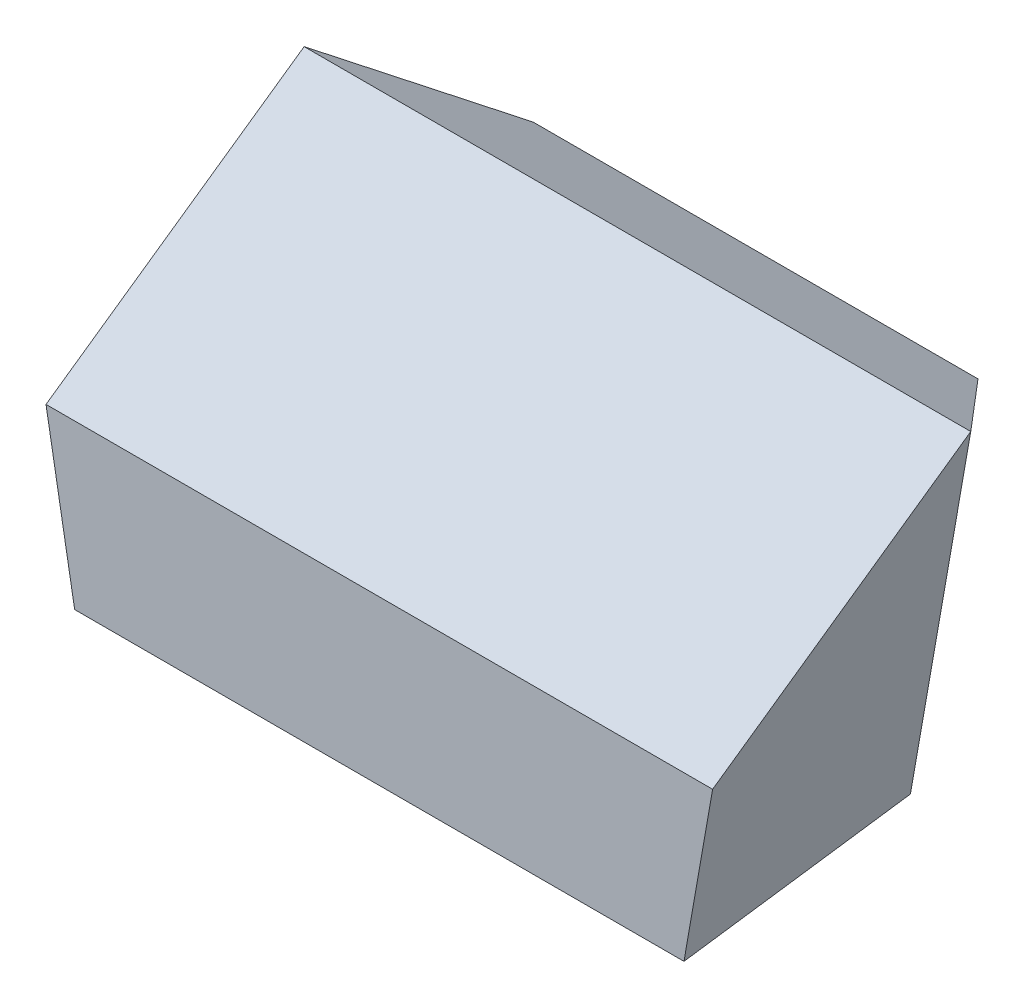
ISO-10303-21;
HEADER;
FILE_DESCRIPTION(('STEP AP214'),'2;1');
FILE_NAME('part.step','',(''),(''),'','','');
FILE_SCHEMA(('AUTOMOTIVE_DESIGN { 1 0 10303 214 1 1 1 1 }'));
ENDSEC;
DATA;
#1=APPLICATION_CONTEXT('core data for automotive mechanical design processes');
#2=APPLICATION_PROTOCOL_DEFINITION('international standard','automotive_design',2000,#1);
#3=PRODUCT_CONTEXT('',#1,'mechanical');
#4=PRODUCT('Part','Part','',(#3));
#5=PRODUCT_RELATED_PRODUCT_CATEGORY('part','',(#4));
#6=PRODUCT_DEFINITION_FORMATION('','',#4);
#7=PRODUCT_DEFINITION_CONTEXT('part definition',#1,'design');
#8=PRODUCT_DEFINITION('design','',#6,#7);
#9=PRODUCT_DEFINITION_SHAPE('','',#8);
#10=(LENGTH_UNIT() NAMED_UNIT(*) SI_UNIT(.MILLI.,.METRE.));
#11=(NAMED_UNIT(*) PLANE_ANGLE_UNIT() SI_UNIT($,.RADIAN.));
#12=(NAMED_UNIT(*) SI_UNIT($,.STERADIAN.) SOLID_ANGLE_UNIT());
#13=UNCERTAINTY_MEASURE_WITH_UNIT(LENGTH_MEASURE(1.E-05),#10,'distance_accuracy_value','');
#14=(GEOMETRIC_REPRESENTATION_CONTEXT(3) GLOBAL_UNCERTAINTY_ASSIGNED_CONTEXT((#13)) GLOBAL_UNIT_ASSIGNED_CONTEXT((#10,
#11,#12)) REPRESENTATION_CONTEXT('',''));
#15=CARTESIAN_POINT('',(0.,0.,0.));
#16=DIRECTION('',(0.,0.,1.));
#17=DIRECTION('',(1.,0.,0.));
#18=AXIS2_PLACEMENT_3D('',#15,#16,#17);
#19=CARTESIAN_POINT('',(0.,0.,0.));
#20=DIRECTION('',(0.,1.,0.));
#21=DIRECTION('',(0.,0.,1.));
#22=AXIS2_PLACEMENT_3D('',#19,#20,#21);
#23=PLANE('',#22);
#24=DIRECTION('',(-0.121869343405144,0.,0.992546151641322));
#25=VECTOR('',#24,1.);
#26=CARTESIAN_POINT('',(-75.4430878194198,0.,200.));
#27=LINE('',#26,#25);
#28=CARTESIAN_POINT('',(-66.3909576530534,0.,126.276316013991));
#29=VERTEX_POINT('',#28);
#30=CARTESIAN_POINT('',(-71.1456281878182,0.,165.));
#31=VERTEX_POINT('',#30);
#32=EDGE_CURVE('E89',#29,#31,#27,.T.);
#33=ORIENTED_EDGE('',*,*,#32,.F.);
#34=DIRECTION('',(-0.71225948077796,0.,0.701916257143194));
#35=VECTOR('',#34,1.);
#36=CARTESIAN_POINT('',(-49.874798816262,0.,110.));
#37=LINE('',#36,#35);
#38=CARTESIAN_POINT('',(-49.874798816262,0.,110.));
#39=VERTEX_POINT('',#38);
#40=EDGE_CURVE('E155',#39,#29,#37,.T.);
#41=ORIENTED_EDGE('',*,*,#40,.F.);
#42=DIRECTION('',(1.,0.,0.));
#43=VECTOR('',#42,1.);
#44=CARTESIAN_POINT('',(-49.874798816262,0.,110.));
#45=LINE('',#44,#43);
#46=CARTESIAN_POINT('',(1.87277538680775,0.,110.));
#47=VERTEX_POINT('',#46);
#48=EDGE_CURVE('E136',#39,#47,#45,.T.);
#49=ORIENTED_EDGE('',*,*,#48,.T.);
#50=DIRECTION('',(0.642084059629472,0.,0.766634241584431));
#51=VECTOR('',#50,1.);
#52=CARTESIAN_POINT('',(1.87277538680775,0.,110.));
#53=LINE('',#52,#51);
#54=CARTESIAN_POINT('',(15.5047820142139,0.,126.276316013991));
#55=VERTEX_POINT('',#54);
#56=EDGE_CURVE('E153',#47,#55,#53,.T.);
#57=ORIENTED_EDGE('',*,*,#56,.T.);
#58=DIRECTION('',(-0.121869343405144,0.,-0.992546151641322));
#59=VECTOR('',#58,1.);
#60=CARTESIAN_POINT('',(3.68353682708704,0.,30.));
#61=LINE('',#60,#59);
#62=CARTESIAN_POINT('',(20.2594525489787,0.,165.));
#63=VERTEX_POINT('',#62);
#64=EDGE_CURVE('E83',#63,#55,#61,.T.);
#65=ORIENTED_EDGE('',*,*,#64,.F.);
#66=DIRECTION('',(1.,0.,0.));
#67=VECTOR('',#66,1.);
#68=CARTESIAN_POINT('',(-75.4430878194198,0.,165.));
#69=LINE('',#68,#67);
#70=EDGE_CURVE('E96',#31,#63,#69,.T.);
#71=ORIENTED_EDGE('',*,*,#70,.F.);
#72=EDGE_LOOP('',(#33,#41,#49,#57,#65,#71));
#73=FACE_BOUND('',#72,.T.);
#74=ADVANCED_FACE('F78',(#73),#23,.F.);
#75=CARTESIAN_POINT('',(0.,93.969262078591,65.7979856674334));
#76=DIRECTION('',(0.,-0.819152044288991,-0.573576436351047));
#77=DIRECTION('',(0.,0.573576436351047,-0.819152044288991));
#78=AXIS2_PLACEMENT_3D('',#75,#76,#77);
#79=PLANE('',#78);
#80=DIRECTION('',(0.,-0.573576436351047,0.819152044288991));
#81=VECTOR('',#80,1.);
#82=CARTESIAN_POINT('',(-75.4430878194198,0.,200.));
#83=LINE('',#82,#81);
#84=CARTESIAN_POINT('',(-75.4430878194198,51.6218792715943,126.276316013991));
#85=VERTEX_POINT('',#84);
#86=CARTESIAN_POINT('',(-75.4430878194198,24.5072638373395,165.));
#87=VERTEX_POINT('',#86);
#88=EDGE_CURVE('E271',#85,#87,#83,.T.);
#89=ORIENTED_EDGE('',*,*,#88,.T.);
#90=DIRECTION('',(1.,0.,0.));
#91=VECTOR('',#90,1.);
#92=CARTESIAN_POINT('',(0.,24.50726383734,165.));
#93=LINE('',#92,#91);
#94=CARTESIAN_POINT('',(24.5569121805802,24.5072638373399,165.));
#95=VERTEX_POINT('',#94);
#96=EDGE_CURVE('E265',#87,#95,#93,.T.);
#97=ORIENTED_EDGE('',*,*,#96,.T.);
#98=DIRECTION('',(0.,0.573576436351047,-0.819152044288991));
#99=VECTOR('',#98,1.);
#100=CARTESIAN_POINT('',(24.5569121805802,0.,200.));
#101=LINE('',#100,#99);
#102=CARTESIAN_POINT('',(24.5569121805802,51.6218792715943,126.276316013991));
#103=VERTEX_POINT('',#102);
#104=EDGE_CURVE('E341',#95,#103,#101,.T.);
#105=ORIENTED_EDGE('',*,*,#104,.T.);
#106=DIRECTION('',(-1.,0.,0.));
#107=VECTOR('',#106,1.);
#108=CARTESIAN_POINT('',(-75.4430878194198,51.6218792715943,126.276316013991));
#109=LINE('',#108,#107);
#110=EDGE_CURVE('E344',#103,#85,#109,.T.);
#111=ORIENTED_EDGE('',*,*,#110,.T.);
#112=EDGE_LOOP('',(#89,#97,#105,#111));
#113=FACE_BOUND('',#112,.T.);
#114=ADVANCED_FACE('F308',(#113),#79,.F.);
#115=CARTESIAN_POINT('',(-75.4430878194198,0.,200.));
#116=DIRECTION('',(-0.977845939688711,-0.171469711169267,-0.120064384335363));
#117=DIRECTION('',(0.,0.573576436351047,-0.819152044288991));
#118=AXIS2_PLACEMENT_3D('',#115,#116,#117);
#119=PLANE('',#118);
#120=DIRECTION('',(-0.172719142932958,0.984971115142218,0.));
#121=VECTOR('',#120,1.);
#122=CARTESIAN_POINT('',(-66.6609999161046,1.53997886080496,126.276316013991));
#123=LINE('',#122,#121);
#124=EDGE_CURVE('E165',#29,#85,#123,.T.);
#125=ORIENTED_EDGE('',*,*,#124,.F.);
#126=ORIENTED_EDGE('',*,*,#32,.T.);
#127=DIRECTION('',(0.172719142932958,-0.984971115142218,0.));
#128=VECTOR('',#127,1.);
#129=CARTESIAN_POINT('',(-71.2738295838389,0.731098301305763,165.));
#130=LINE('',#129,#128);
#131=EDGE_CURVE('E267',#87,#31,#130,.T.);
#132=ORIENTED_EDGE('',*,*,#131,.F.);
#133=ORIENTED_EDGE('',*,*,#88,.F.);
#134=EDGE_LOOP('',(#125,#126,#132,#133));
#135=FACE_BOUND('',#134,.T.);
#136=ADVANCED_FACE('F80',(#135),#119,.T.);
#137=CARTESIAN_POINT('',(24.5569121805802,51.6218792715943,126.276316013991));
#138=DIRECTION('',(0.977845939688711,-0.171469711169267,-0.120064384335363));
#139=DIRECTION('',(0.,-0.573576436351047,0.819152044288991));
#140=AXIS2_PLACEMENT_3D('',#137,#138,#139);
#141=PLANE('',#140);
#142=DIRECTION('',(-0.172719142932958,-0.984971115142218,0.));
#143=VECTOR('',#142,1.);
#144=CARTESIAN_POINT('',(24.5569121805802,51.6218792715943,126.276316013991));
#145=LINE('',#144,#143);
#146=EDGE_CURVE('E162',#103,#55,#145,.T.);
#147=ORIENTED_EDGE('',*,*,#146,.F.);
#148=ORIENTED_EDGE('',*,*,#104,.F.);
#149=DIRECTION('',(0.172719142932958,0.984971115142218,0.));
#150=VECTOR('',#149,1.);
#151=CARTESIAN_POINT('',(29.1697418483145,50.8129987120951,165.));
#152=LINE('',#151,#150);
#153=EDGE_CURVE('E12',#63,#95,#152,.T.);
#154=ORIENTED_EDGE('',*,*,#153,.F.);
#155=ORIENTED_EDGE('',*,*,#64,.T.);
#156=EDGE_LOOP('',(#147,#148,#154,#155));
#157=FACE_BOUND('',#156,.T.);
#158=ADVANCED_FACE('F295',(#157),#141,.T.);
#159=CARTESIAN_POINT('',(-75.4430878194198,51.6268892715943,165.));
#160=DIRECTION('',(0.,0.,-1.));
#161=DIRECTION('',(-1.,0.,0.));
#162=AXIS2_PLACEMENT_3D('',#159,#160,#161);
#163=PLANE('',#162);
#164=ORIENTED_EDGE('',*,*,#131,.T.);
#165=ORIENTED_EDGE('',*,*,#70,.T.);
#166=ORIENTED_EDGE('',*,*,#153,.T.);
#167=ORIENTED_EDGE('',*,*,#96,.F.);
#168=EDGE_LOOP('',(#164,#165,#166,#167));
#169=FACE_BOUND('',#168,.T.);
#170=ADVANCED_FACE('F196',(#169),#163,.F.);
#171=CARTESIAN_POINT('',(0.,0.,110.));
#172=DIRECTION('',(0.,0.,1.));
#173=DIRECTION('',(1.,0.,0.));
#174=AXIS2_PLACEMENT_3D('',#171,#172,#173);
#175=PLANE('',#174);
#176=ORIENTED_EDGE('',*,*,#48,.F.);
#177=DIRECTION('',(0.172719142932958,-0.984971115142218,0.));
#178=VECTOR('',#177,1.);
#179=CARTESIAN_POINT('',(-57.3666434640963,42.7239879259585,110.));
#180=LINE('',#179,#178);
#181=CARTESIAN_POINT('',(-57.3666434640963,42.7239879259585,110.));
#182=VERTEX_POINT('',#181);
#183=EDGE_CURVE('E211',#182,#39,#180,.T.);
#184=ORIENTED_EDGE('',*,*,#183,.F.);
#185=DIRECTION('',(-1.,0.,0.));
#186=VECTOR('',#185,1.);
#187=CARTESIAN_POINT('',(9.36462003464204,42.7239879259585,110.));
#188=LINE('',#187,#186);
#189=CARTESIAN_POINT('',(9.36462003464204,42.7239879259585,110.));
#190=VERTEX_POINT('',#189);
#191=EDGE_CURVE('E139',#190,#182,#188,.T.);
#192=ORIENTED_EDGE('',*,*,#191,.F.);
#193=DIRECTION('',(0.172719142932958,0.984971115142218,0.));
#194=VECTOR('',#193,1.);
#195=CARTESIAN_POINT('',(1.87277538680775,0.,110.));
#196=LINE('',#195,#194);
#197=EDGE_CURVE('E132',#47,#190,#196,.T.);
#198=ORIENTED_EDGE('',*,*,#197,.F.);
#199=EDGE_LOOP('',(#176,#184,#192,#198));
#200=FACE_BOUND('',#199,.T.);
#201=ADVANCED_FACE('F135',(#200),#175,.F.);
#202=CARTESIAN_POINT('',(0.,-13.4044939648616,7.32793162408773));
#203=DIRECTION('',(0.,0.877444181984261,-0.479678754482592));
#204=DIRECTION('',(0.,0.479678754482592,0.877444181984261));
#205=AXIS2_PLACEMENT_3D('',#202,#203,#204);
#206=PLANE('',#205);
#207=DIRECTION('',(-0.697912044552852,0.343538000016743,0.628411028398256));
#208=VECTOR('',#207,1.);
#209=CARTESIAN_POINT('',(-57.3666434640963,42.7239879259585,110.));
#210=LINE('',#209,#208);
#211=EDGE_CURVE('E203',#182,#85,#210,.T.);
#212=ORIENTED_EDGE('',*,*,#211,.T.);
#213=ORIENTED_EDGE('',*,*,#110,.F.);
#214=DIRECTION('',(0.63361931140678,0.371101064489561,0.678830294069963));
#215=VECTOR('',#214,1.);
#216=CARTESIAN_POINT('',(9.36462003464204,42.7239879259585,110.));
#217=LINE('',#216,#215);
#218=EDGE_CURVE('E167',#190,#103,#217,.T.);
#219=ORIENTED_EDGE('',*,*,#218,.F.);
#220=ORIENTED_EDGE('',*,*,#191,.T.);
#221=EDGE_LOOP('',(#212,#213,#219,#220));
#222=FACE_BOUND('',#221,.T.);
#223=ADVANCED_FACE('F189',(#222),#206,.T.);
#224=CARTESIAN_POINT('',(-52.1044751143805,9.13675553158536,43.63939293549));
#225=DIRECTION('',(0.759799370565935,-0.133234258413965,-0.636359606568872));
#226=DIRECTION('',(-0.642084059629473,0.,-0.766634241584431));
#227=AXIS2_PLACEMENT_3D('',#224,#225,#226);
#228=PLANE('',#227);
#229=ORIENTED_EDGE('',*,*,#218,.T.);
#230=ORIENTED_EDGE('',*,*,#146,.T.);
#231=ORIENTED_EDGE('',*,*,#56,.F.);
#232=ORIENTED_EDGE('',*,*,#197,.T.);
#233=EDGE_LOOP('',(#229,#230,#231,#232));
#234=FACE_BOUND('',#233,.T.);
#235=ADVANCED_FACE('F160',(#234),#228,.T.);
#236=CARTESIAN_POINT('',(29.9674804066456,5.25493331948998,30.4090720473321));
#237=DIRECTION('',(-0.696658999937163,-0.122162308656437,-0.706924754235047));
#238=DIRECTION('',(-0.71225948077796,0.,0.701916257143194));
#239=AXIS2_PLACEMENT_3D('',#236,#237,#238);
#240=PLANE('',#239);
#241=ORIENTED_EDGE('',*,*,#40,.T.);
#242=ORIENTED_EDGE('',*,*,#124,.T.);
#243=ORIENTED_EDGE('',*,*,#211,.F.);
#244=ORIENTED_EDGE('',*,*,#183,.T.);
#245=EDGE_LOOP('',(#241,#242,#243,#244));
#246=FACE_BOUND('',#245,.T.);
#247=ADVANCED_FACE('F188',(#246),#240,.T.);
#248=CLOSED_SHELL('',(#74,#114,#136,#158,#170,#201,#223,#235,#247));
#249=MANIFOLD_SOLID_BREP('B2',#248);
#250=ADVANCED_BREP_SHAPE_REPRESENTATION('',(#18,#249),#14);
#251=SHAPE_DEFINITION_REPRESENTATION(#9,#250);
ENDSEC;
END-ISO-10303-21;
